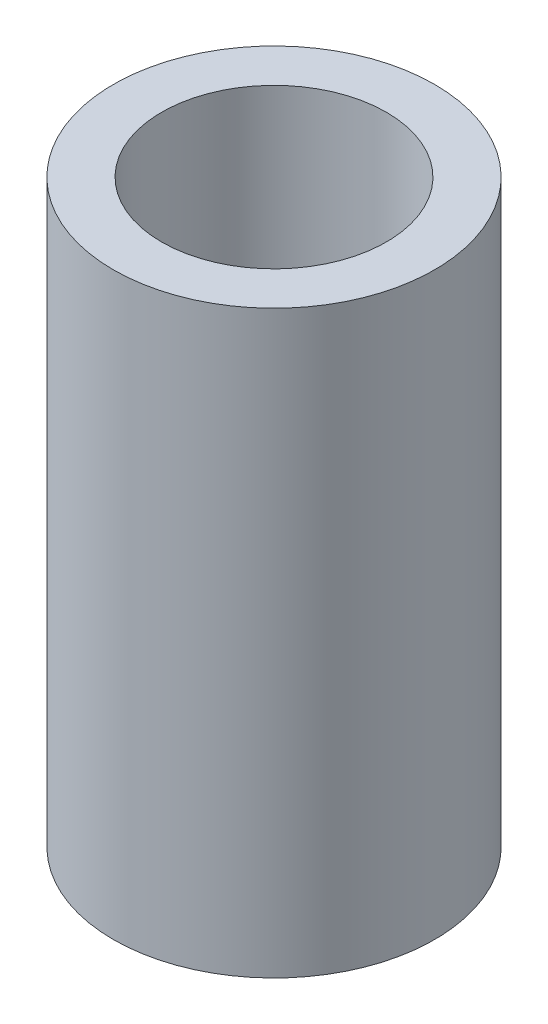
ISO-10303-21;
HEADER;
FILE_DESCRIPTION(('STEP AP214'),'2;1');
FILE_NAME('part.step','',(''),(''),'','','');
FILE_SCHEMA(('AUTOMOTIVE_DESIGN { 1 0 10303 214 1 1 1 1 }'));
ENDSEC;
DATA;
#1=APPLICATION_CONTEXT('core data for automotive mechanical design processes');
#2=APPLICATION_PROTOCOL_DEFINITION('international standard','automotive_design',2000,#1);
#3=PRODUCT_CONTEXT('',#1,'mechanical');
#4=PRODUCT('Part','Part','',(#3));
#5=PRODUCT_RELATED_PRODUCT_CATEGORY('part','',(#4));
#6=PRODUCT_DEFINITION_FORMATION('','',#4);
#7=PRODUCT_DEFINITION_CONTEXT('part definition',#1,'design');
#8=PRODUCT_DEFINITION('design','',#6,#7);
#9=PRODUCT_DEFINITION_SHAPE('','',#8);
#10=(LENGTH_UNIT() NAMED_UNIT(*) SI_UNIT(.MILLI.,.METRE.));
#11=(NAMED_UNIT(*) PLANE_ANGLE_UNIT() SI_UNIT($,.RADIAN.));
#12=(NAMED_UNIT(*) SI_UNIT($,.STERADIAN.) SOLID_ANGLE_UNIT());
#13=UNCERTAINTY_MEASURE_WITH_UNIT(LENGTH_MEASURE(1.E-05),#10,'distance_accuracy_value','');
#14=(GEOMETRIC_REPRESENTATION_CONTEXT(3) GLOBAL_UNCERTAINTY_ASSIGNED_CONTEXT((#13)) GLOBAL_UNIT_ASSIGNED_CONTEXT((#10,
#11,#12)) REPRESENTATION_CONTEXT('',''));
#15=CARTESIAN_POINT('',(0.,0.,0.));
#16=DIRECTION('',(0.,0.,1.));
#17=DIRECTION('',(1.,0.,0.));
#18=AXIS2_PLACEMENT_3D('',#15,#16,#17);
#19=CARTESIAN_POINT('',(0.,-10.32,0.));
#20=DIRECTION('',(0.,1.,0.));
#21=DIRECTION('',(0.,0.,1.));
#22=AXIS2_PLACEMENT_3D('',#19,#20,#21);
#23=CYLINDRICAL_SURFACE('',#22,2.8575);
#24=CARTESIAN_POINT('',(0.,-10.32,0.));
#25=DIRECTION('',(0.,1.,0.));
#26=DIRECTION('',(0.,0.,1.));
#27=AXIS2_PLACEMENT_3D('',#24,#25,#26);
#28=CIRCLE('',#27,2.8575);
#29=CARTESIAN_POINT('',(0.,-10.32,2.8575));
#30=VERTEX_POINT('',#29);
#31=EDGE_CURVE('E10',#30,#30,#28,.T.);
#32=ORIENTED_EDGE('',*,*,#31,.T.);
#33=EDGE_LOOP('',(#32));
#34=FACE_BOUND('',#33,.T.);
#35=CARTESIAN_POINT('',(0.,0.,0.));
#36=DIRECTION('',(0.,1.,0.));
#37=DIRECTION('',(0.,0.,1.));
#38=AXIS2_PLACEMENT_3D('',#35,#36,#37);
#39=CIRCLE('',#38,2.8575);
#40=CARTESIAN_POINT('',(0.,0.,2.8575));
#41=VERTEX_POINT('',#40);
#42=EDGE_CURVE('E38',#41,#41,#39,.T.);
#43=ORIENTED_EDGE('',*,*,#42,.F.);
#44=EDGE_LOOP('',(#43));
#45=FACE_BOUND('',#44,.T.);
#46=ADVANCED_FACE('F35',(#34,#45),#23,.T.);
#47=CARTESIAN_POINT('',(0.,-10.32,0.));
#48=DIRECTION('',(0.,1.,0.));
#49=DIRECTION('',(0.,0.,1.));
#50=AXIS2_PLACEMENT_3D('',#47,#48,#49);
#51=PLANE('',#50);
#52=CARTESIAN_POINT('',(0.,-10.32,0.));
#53=DIRECTION('',(0.,1.,0.));
#54=DIRECTION('',(0.,0.,1.));
#55=AXIS2_PLACEMENT_3D('',#52,#53,#54);
#56=CIRCLE('',#55,2.);
#57=CARTESIAN_POINT('',(0.,-10.32,2.));
#58=VERTEX_POINT('',#57);
#59=EDGE_CURVE('E45',#58,#58,#56,.T.);
#60=ORIENTED_EDGE('',*,*,#59,.T.);
#61=EDGE_LOOP('',(#60));
#62=FACE_BOUND('',#61,.T.);
#63=ORIENTED_EDGE('',*,*,#31,.F.);
#64=EDGE_LOOP('',(#63));
#65=FACE_BOUND('',#64,.T.);
#66=ADVANCED_FACE('F53',(#62,#65),#51,.F.);
#67=CARTESIAN_POINT('',(0.,0.,0.));
#68=DIRECTION('',(0.,1.,0.));
#69=DIRECTION('',(0.,0.,1.));
#70=AXIS2_PLACEMENT_3D('',#67,#68,#69);
#71=PLANE('',#70);
#72=CARTESIAN_POINT('',(0.,0.,0.));
#73=DIRECTION('',(0.,1.,0.));
#74=DIRECTION('',(0.,0.,1.));
#75=AXIS2_PLACEMENT_3D('',#72,#73,#74);
#76=CIRCLE('',#75,2.);
#77=CARTESIAN_POINT('',(0.,0.,2.));
#78=VERTEX_POINT('',#77);
#79=EDGE_CURVE('E47',#78,#78,#76,.T.);
#80=ORIENTED_EDGE('',*,*,#79,.F.);
#81=EDGE_LOOP('',(#80));
#82=FACE_BOUND('',#81,.T.);
#83=ORIENTED_EDGE('',*,*,#42,.T.);
#84=EDGE_LOOP('',(#83));
#85=FACE_BOUND('',#84,.T.);
#86=ADVANCED_FACE('F59',(#82,#85),#71,.T.);
#87=CARTESIAN_POINT('',(0.,-10.32,0.));
#88=DIRECTION('',(0.,1.,0.));
#89=DIRECTION('',(0.,0.,1.));
#90=AXIS2_PLACEMENT_3D('',#87,#88,#89);
#91=CYLINDRICAL_SURFACE('',#90,2.);
#92=ORIENTED_EDGE('',*,*,#59,.F.);
#93=EDGE_LOOP('',(#92));
#94=FACE_BOUND('',#93,.T.);
#95=ORIENTED_EDGE('',*,*,#79,.T.);
#96=EDGE_LOOP('',(#95));
#97=FACE_BOUND('',#96,.T.);
#98=ADVANCED_FACE('F56',(#94,#97),#91,.F.);
#99=CLOSED_SHELL('',(#46,#66,#86,#98));
#100=MANIFOLD_SOLID_BREP('B2',#99);
#101=ADVANCED_BREP_SHAPE_REPRESENTATION('',(#18,#100),#14);
#102=SHAPE_DEFINITION_REPRESENTATION(#9,#101);
ENDSEC;
END-ISO-10303-21;
